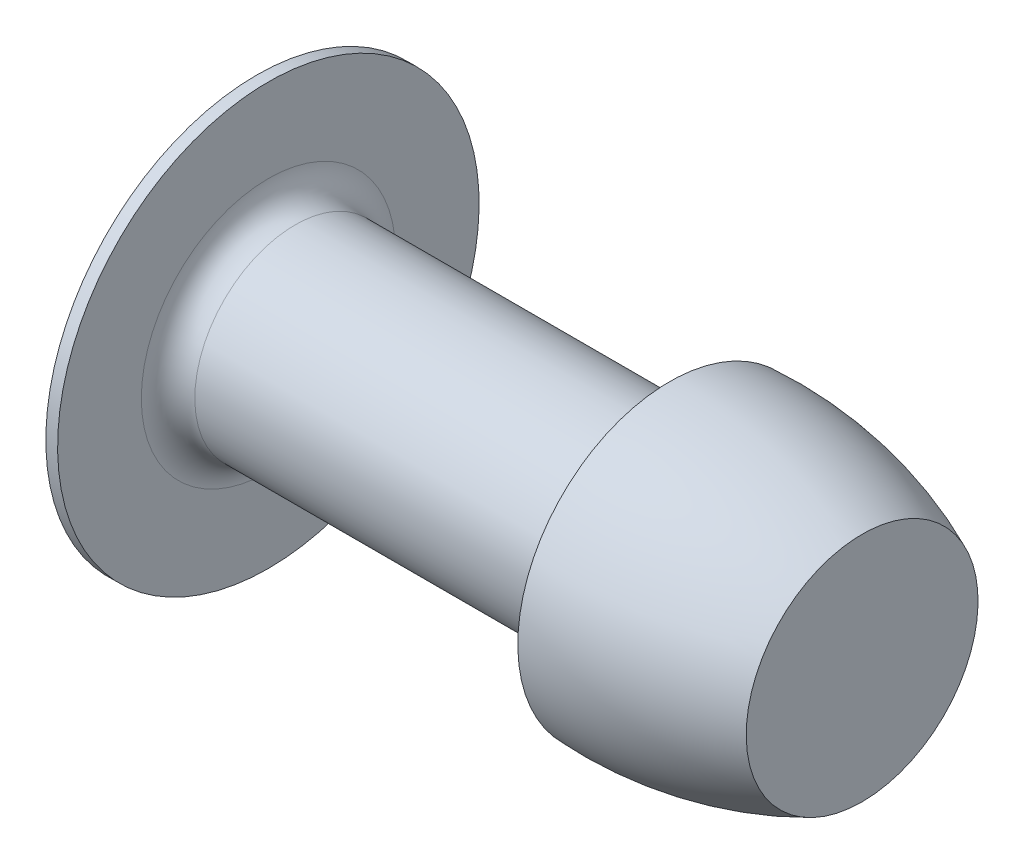
ISO-10303-21;
HEADER;
FILE_DESCRIPTION(('STEP AP214'),'2;1');
FILE_NAME('part.step','',(''),(''),'','','');
FILE_SCHEMA(('AUTOMOTIVE_DESIGN { 1 0 10303 214 1 1 1 1 }'));
ENDSEC;
DATA;
#1=APPLICATION_CONTEXT('core data for automotive mechanical design processes');
#2=APPLICATION_PROTOCOL_DEFINITION('international standard','automotive_design',2000,#1);
#3=PRODUCT_CONTEXT('',#1,'mechanical');
#4=PRODUCT('Part','Part','',(#3));
#5=PRODUCT_RELATED_PRODUCT_CATEGORY('part','',(#4));
#6=PRODUCT_DEFINITION_FORMATION('','',#4);
#7=PRODUCT_DEFINITION_CONTEXT('part definition',#1,'design');
#8=PRODUCT_DEFINITION('design','',#6,#7);
#9=PRODUCT_DEFINITION_SHAPE('','',#8);
#10=(LENGTH_UNIT() NAMED_UNIT(*) SI_UNIT(.MILLI.,.METRE.));
#11=(NAMED_UNIT(*) PLANE_ANGLE_UNIT() SI_UNIT($,.RADIAN.));
#12=(NAMED_UNIT(*) SI_UNIT($,.STERADIAN.) SOLID_ANGLE_UNIT());
#13=UNCERTAINTY_MEASURE_WITH_UNIT(LENGTH_MEASURE(1.E-05),#10,'distance_accuracy_value','');
#14=(GEOMETRIC_REPRESENTATION_CONTEXT(3) GLOBAL_UNCERTAINTY_ASSIGNED_CONTEXT((#13)) GLOBAL_UNIT_ASSIGNED_CONTEXT((#10,
#11,#12)) REPRESENTATION_CONTEXT('',''));
#15=CARTESIAN_POINT('',(0.,0.,0.));
#16=DIRECTION('',(0.,0.,1.));
#17=DIRECTION('',(1.,0.,0.));
#18=AXIS2_PLACEMENT_3D('',#15,#16,#17);
#19=CARTESIAN_POINT('',(9.15695918367347,0.,0.));
#20=DIRECTION('',(-1.,0.,0.));
#21=DIRECTION('',(0.,1.,0.));
#22=AXIS2_PLACEMENT_3D('',#19,#20,#21);
#23=SPHERICAL_SURFACE('',#22,10.6809591836735);
#24=CARTESIAN_POINT('',(-0.279399999999999,0.,0.));
#25=DIRECTION('',(-1.,0.,0.));
#26=DIRECTION('',(0.,-1.,0.));
#27=AXIS2_PLACEMENT_3D('',#24,#25,#26);
#28=CIRCLE('',#27,5.0038);
#29=CARTESIAN_POINT('',(-0.279399999999997,-5.0038,0.));
#30=VERTEX_POINT('',#29);
#31=EDGE_CURVE('E54',#30,#30,#28,.T.);
#32=ORIENTED_EDGE('',*,*,#31,.T.);
#33=EDGE_LOOP('',(#32));
#34=FACE_BOUND('',#33,.T.);
#35=ADVANCED_FACE('F28',(#34),#23,.T.);
#36=CARTESIAN_POINT('',(14.098,2.75209,0.));
#37=DIRECTION('',(-1.,0.,0.));
#38=DIRECTION('',(0.,-1.,0.));
#39=AXIS2_PLACEMENT_3D('',#36,#37,#38);
#40=PLANE('',#39);
#41=CARTESIAN_POINT('',(14.098,0.,0.));
#42=DIRECTION('',(-1.,0.,0.));
#43=DIRECTION('',(0.,-1.,0.));
#44=AXIS2_PLACEMENT_3D('',#41,#42,#43);
#45=CIRCLE('',#44,2.75209);
#46=CARTESIAN_POINT('',(14.098,-2.75209,0.));
#47=VERTEX_POINT('',#46);
#48=EDGE_CURVE('E39',#47,#47,#45,.T.);
#49=ORIENTED_EDGE('',*,*,#48,.F.);
#50=EDGE_LOOP('',(#49));
#51=FACE_BOUND('',#50,.T.);
#52=ADVANCED_FACE('F75',(#51),#40,.F.);
#53=CARTESIAN_POINT('',(10.0315413715325,0.,0.));
#54=DIRECTION('',(-1.,0.,0.));
#55=DIRECTION('',(0.,-1.,0.));
#56=AXIS2_PLACEMENT_3D('',#53,#54,#55);
#57=DEGENERATE_TOROIDAL_SURFACE('',#56,6.39208694398801,10.0076,.F.);
#58=CARTESIAN_POINT('',(9.526,0.,0.));
#59=DIRECTION('',(-1.,0.,0.));
#60=DIRECTION('',(0.,-1.,0.));
#61=AXIS2_PLACEMENT_3D('',#58,#59,#60);
#62=CIRCLE('',#61,3.602736);
#63=CARTESIAN_POINT('',(9.52600000000001,-3.602736,0.));
#64=VERTEX_POINT('',#63);
#65=EDGE_CURVE('E43',#64,#64,#62,.T.);
#66=ORIENTED_EDGE('',*,*,#65,.F.);
#67=EDGE_LOOP('',(#66));
#68=FACE_BOUND('',#67,.T.);
#69=ORIENTED_EDGE('',*,*,#48,.T.);
#70=EDGE_LOOP('',(#69));
#71=FACE_BOUND('',#70,.T.);
#72=ADVANCED_FACE('F79',(#68,#71),#57,.F.);
#73=CARTESIAN_POINT('',(9.526,2.38125,0.));
#74=DIRECTION('',(1.,0.,0.));
#75=DIRECTION('',(0.,1.,0.));
#76=AXIS2_PLACEMENT_3D('',#73,#74,#75);
#77=PLANE('',#76);
#78=CARTESIAN_POINT('',(9.526,0.,0.));
#79=DIRECTION('',(-1.,0.,0.));
#80=DIRECTION('',(0.,-1.,0.));
#81=AXIS2_PLACEMENT_3D('',#78,#79,#80);
#82=CIRCLE('',#81,2.38125);
#83=CARTESIAN_POINT('',(9.526,-2.38125,0.));
#84=VERTEX_POINT('',#83);
#85=EDGE_CURVE('E48',#84,#84,#82,.T.);
#86=ORIENTED_EDGE('',*,*,#85,.F.);
#87=EDGE_LOOP('',(#86));
#88=FACE_BOUND('',#87,.T.);
#89=ORIENTED_EDGE('',*,*,#65,.T.);
#90=EDGE_LOOP('',(#89));
#91=FACE_BOUND('',#90,.T.);
#92=ADVANCED_FACE('F72',(#88,#91),#77,.F.);
#93=CARTESIAN_POINT('',(-1.524,0.,0.));
#94=DIRECTION('',(-1.,0.,0.));
#95=DIRECTION('',(0.,-1.,0.));
#96=AXIS2_PLACEMENT_3D('',#93,#94,#95);
#97=CYLINDRICAL_SURFACE('',#96,2.38125);
#98=CARTESIAN_POINT('',(0.635000000000001,0.,0.));
#99=DIRECTION('',(-1.,0.,0.));
#100=DIRECTION('',(0.,-1.,0.));
#101=AXIS2_PLACEMENT_3D('',#98,#99,#100);
#102=CIRCLE('',#101,2.38125);
#103=CARTESIAN_POINT('',(0.635000000000002,-2.38125,0.));
#104=VERTEX_POINT('',#103);
#105=EDGE_CURVE('E10',#104,#104,#102,.F.);
#106=ORIENTED_EDGE('',*,*,#105,.T.);
#107=EDGE_LOOP('',(#106));
#108=FACE_BOUND('',#107,.T.);
#109=ORIENTED_EDGE('',*,*,#85,.T.);
#110=EDGE_LOOP('',(#109));
#111=FACE_BOUND('',#110,.T.);
#112=ADVANCED_FACE('F67',(#108,#111),#97,.T.);
#113=CARTESIAN_POINT('',(0.,5.0038,0.));
#114=DIRECTION('',(-1.,0.,0.));
#115=DIRECTION('',(0.,-1.,0.));
#116=AXIS2_PLACEMENT_3D('',#113,#114,#115);
#117=PLANE('',#116);
#118=CARTESIAN_POINT('',(0.,0.,0.));
#119=DIRECTION('',(-1.,0.,0.));
#120=DIRECTION('',(0.,-1.,0.));
#121=AXIS2_PLACEMENT_3D('',#118,#119,#120);
#122=CIRCLE('',#121,3.01625);
#123=CARTESIAN_POINT('',(0.,-3.01625,0.));
#124=VERTEX_POINT('',#123);
#125=EDGE_CURVE('E35',#124,#124,#122,.T.);
#126=ORIENTED_EDGE('',*,*,#125,.T.);
#127=EDGE_LOOP('',(#126));
#128=FACE_BOUND('',#127,.T.);
#129=CARTESIAN_POINT('',(0.,0.,0.));
#130=DIRECTION('',(-1.,0.,0.));
#131=DIRECTION('',(0.,-1.,0.));
#132=AXIS2_PLACEMENT_3D('',#129,#130,#131);
#133=CIRCLE('',#132,5.0038);
#134=CARTESIAN_POINT('',(0.,-5.0038,0.));
#135=VERTEX_POINT('',#134);
#136=EDGE_CURVE('E51',#135,#135,#133,.T.);
#137=ORIENTED_EDGE('',*,*,#136,.F.);
#138=EDGE_LOOP('',(#137));
#139=FACE_BOUND('',#138,.T.);
#140=ADVANCED_FACE('F62',(#128,#139),#117,.F.);
#141=CARTESIAN_POINT('',(-1.524,0.,0.));
#142=DIRECTION('',(-1.,0.,0.));
#143=DIRECTION('',(0.,-1.,0.));
#144=AXIS2_PLACEMENT_3D('',#141,#142,#143);
#145=CYLINDRICAL_SURFACE('',#144,5.0038);
#146=ORIENTED_EDGE('',*,*,#31,.F.);
#147=EDGE_LOOP('',(#146));
#148=FACE_BOUND('',#147,.T.);
#149=ORIENTED_EDGE('',*,*,#136,.T.);
#150=EDGE_LOOP('',(#149));
#151=FACE_BOUND('',#150,.T.);
#152=ADVANCED_FACE('F59',(#148,#151),#145,.T.);
#153=CARTESIAN_POINT('',(0.635000000000001,0.,0.));
#154=DIRECTION('',(-1.,0.,0.));
#155=DIRECTION('',(0.,-1.,0.));
#156=AXIS2_PLACEMENT_3D('',#153,#154,#155);
#157=TOROIDAL_SURFACE('',#156,3.01625,0.635);
#158=ORIENTED_EDGE('',*,*,#105,.F.);
#159=EDGE_LOOP('',(#158));
#160=FACE_BOUND('',#159,.T.);
#161=ORIENTED_EDGE('',*,*,#125,.F.);
#162=EDGE_LOOP('',(#161));
#163=FACE_BOUND('',#162,.T.);
#164=ADVANCED_FACE('F30',(#160,#163),#157,.F.);
#165=CLOSED_SHELL('',(#35,#52,#72,#92,#112,#140,#152,#164));
#166=MANIFOLD_SOLID_BREP('B2',#165);
#167=ADVANCED_BREP_SHAPE_REPRESENTATION('',(#18,#166),#14);
#168=SHAPE_DEFINITION_REPRESENTATION(#9,#167);
ENDSEC;
END-ISO-10303-21;
